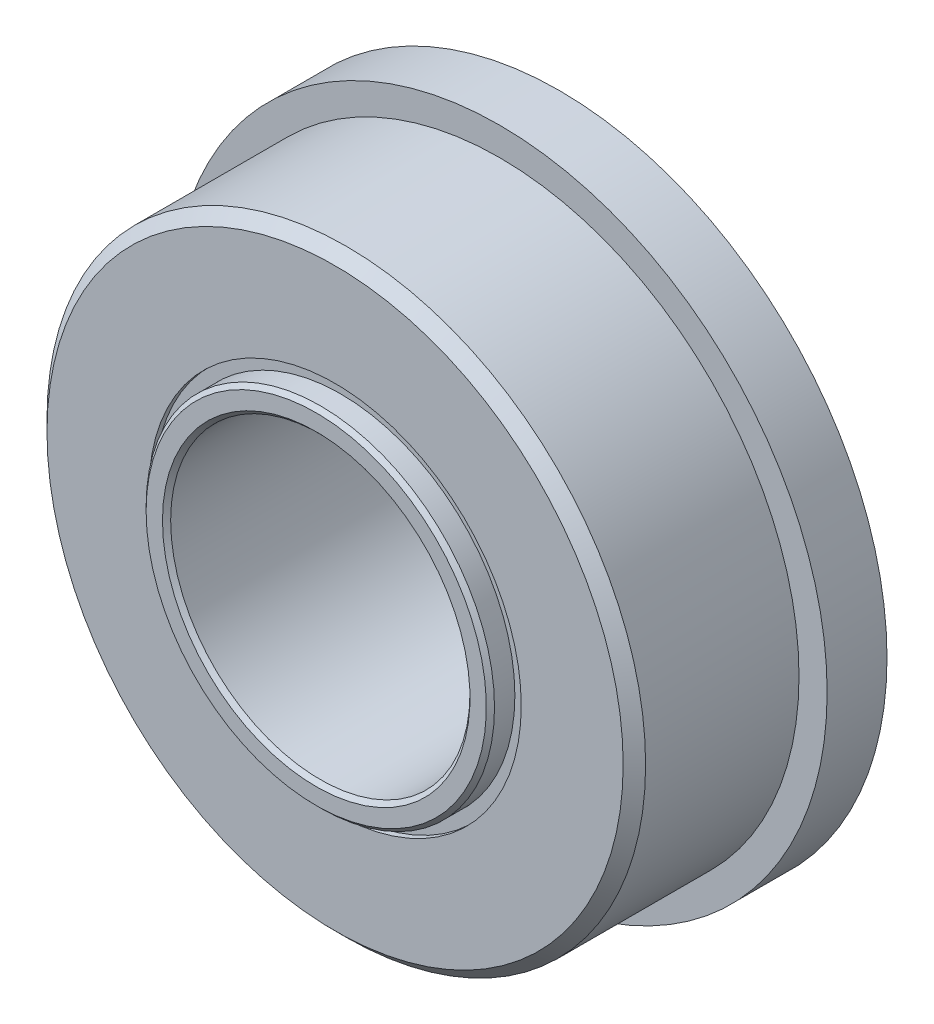
ISO-10303-21;
HEADER;
FILE_DESCRIPTION(('STEP AP214'),'2;1');
FILE_NAME('part.step','',(''),(''),'','','');
FILE_SCHEMA(('AUTOMOTIVE_DESIGN { 1 0 10303 214 1 1 1 1 }'));
ENDSEC;
DATA;
#1=APPLICATION_CONTEXT('core data for automotive mechanical design processes');
#2=APPLICATION_PROTOCOL_DEFINITION('international standard','automotive_design',2000,#1);
#3=PRODUCT_CONTEXT('',#1,'mechanical');
#4=PRODUCT('Part','Part','',(#3));
#5=PRODUCT_RELATED_PRODUCT_CATEGORY('part','',(#4));
#6=PRODUCT_DEFINITION_FORMATION('','',#4);
#7=PRODUCT_DEFINITION_CONTEXT('part definition',#1,'design');
#8=PRODUCT_DEFINITION('design','',#6,#7);
#9=PRODUCT_DEFINITION_SHAPE('','',#8);
#10=(LENGTH_UNIT() NAMED_UNIT(*) SI_UNIT(.MILLI.,.METRE.));
#11=(NAMED_UNIT(*) PLANE_ANGLE_UNIT() SI_UNIT($,.RADIAN.));
#12=(NAMED_UNIT(*) SI_UNIT($,.STERADIAN.) SOLID_ANGLE_UNIT());
#13=UNCERTAINTY_MEASURE_WITH_UNIT(LENGTH_MEASURE(1.E-05),#10,'distance_accuracy_value','');
#14=(GEOMETRIC_REPRESENTATION_CONTEXT(3) GLOBAL_UNCERTAINTY_ASSIGNED_CONTEXT((#13)) GLOBAL_UNIT_ASSIGNED_CONTEXT((#10,
#11,#12)) REPRESENTATION_CONTEXT('',''));
#15=CARTESIAN_POINT('',(0.,0.,0.));
#16=DIRECTION('',(0.,0.,1.));
#17=DIRECTION('',(1.,0.,0.));
#18=AXIS2_PLACEMENT_3D('',#15,#16,#17);
#19=CARTESIAN_POINT('',(0.,3.9497,-2.2621875));
#20=DIRECTION('',(0.,0.,1.));
#21=DIRECTION('',(1.,0.,0.));
#22=AXIS2_PLACEMENT_3D('',#19,#20,#21);
#23=PLANE('',#22);
#24=CARTESIAN_POINT('',(0.,0.,-2.2621875));
#25=DIRECTION('',(0.,0.,1.));
#26=DIRECTION('',(1.,0.,0.));
#27=AXIS2_PLACEMENT_3D('',#24,#25,#26);
#28=CIRCLE('',#27,3.9497);
#29=CARTESIAN_POINT('',(3.9497,0.,-2.2621875));
#30=VERTEX_POINT('',#29);
#31=EDGE_CURVE('E56',#30,#30,#28,.T.);
#32=ORIENTED_EDGE('',*,*,#31,.F.);
#33=EDGE_LOOP('',(#32));
#34=FACE_BOUND('',#33,.T.);
#35=CARTESIAN_POINT('',(0.,0.,-2.2621875));
#36=DIRECTION('',(0.,0.,1.));
#37=DIRECTION('',(1.,0.,0.));
#38=AXIS2_PLACEMENT_3D('',#35,#36,#37);
#39=CIRCLE('',#38,3.6957);
#40=CARTESIAN_POINT('',(3.6957,0.,-2.2621875));
#41=VERTEX_POINT('',#40);
#42=EDGE_CURVE('E11',#41,#41,#39,.T.);
#43=ORIENTED_EDGE('',*,*,#42,.T.);
#44=EDGE_LOOP('',(#43));
#45=FACE_BOUND('',#44,.T.);
#46=ADVANCED_FACE('F42',(#34,#45),#23,.F.);
#47=CARTESIAN_POINT('',(0.,0.,2.38125));
#48=DIRECTION('',(0.,0.,1.));
#49=DIRECTION('',(1.,0.,0.));
#50=AXIS2_PLACEMENT_3D('',#47,#48,#49);
#51=CYLINDRICAL_SURFACE('',#50,3.6957);
#52=ORIENTED_EDGE('',*,*,#42,.F.);
#53=EDGE_LOOP('',(#52));
#54=FACE_BOUND('',#53,.T.);
#55=CARTESIAN_POINT('',(0.,0.,-0.793750000000001));
#56=DIRECTION('',(0.,0.,1.));
#57=DIRECTION('',(1.,0.,0.));
#58=AXIS2_PLACEMENT_3D('',#55,#56,#57);
#59=CIRCLE('',#58,3.6957);
#60=CARTESIAN_POINT('',(3.6957,0.,-0.793750000000001));
#61=VERTEX_POINT('',#60);
#62=EDGE_CURVE('E48',#61,#61,#59,.T.);
#63=ORIENTED_EDGE('',*,*,#62,.T.);
#64=EDGE_LOOP('',(#63));
#65=FACE_BOUND('',#64,.T.);
#66=ADVANCED_FACE('F65',(#54,#65),#51,.F.);
#67=CARTESIAN_POINT('',(0.,3.9497,-0.793750000000001));
#68=DIRECTION('',(0.,0.,-1.));
#69=DIRECTION('',(-1.,0.,0.));
#70=AXIS2_PLACEMENT_3D('',#67,#68,#69);
#71=PLANE('',#70);
#72=ORIENTED_EDGE('',*,*,#62,.F.);
#73=EDGE_LOOP('',(#72));
#74=FACE_BOUND('',#73,.T.);
#75=CARTESIAN_POINT('',(0.,0.,-0.793750000000001));
#76=DIRECTION('',(0.,0.,1.));
#77=DIRECTION('',(1.,0.,0.));
#78=AXIS2_PLACEMENT_3D('',#75,#76,#77);
#79=CIRCLE('',#78,3.9497);
#80=CARTESIAN_POINT('',(3.9497,0.,-0.793750000000001));
#81=VERTEX_POINT('',#80);
#82=EDGE_CURVE('E52',#81,#81,#79,.T.);
#83=ORIENTED_EDGE('',*,*,#82,.T.);
#84=EDGE_LOOP('',(#83));
#85=FACE_BOUND('',#84,.T.);
#86=ADVANCED_FACE('F69',(#74,#85),#71,.F.);
#87=CARTESIAN_POINT('',(0.,0.,2.38125));
#88=DIRECTION('',(0.,0.,1.));
#89=DIRECTION('',(1.,0.,0.));
#90=AXIS2_PLACEMENT_3D('',#87,#88,#89);
#91=CYLINDRICAL_SURFACE('',#90,3.9497);
#92=ORIENTED_EDGE('',*,*,#82,.F.);
#93=EDGE_LOOP('',(#92));
#94=FACE_BOUND('',#93,.T.);
#95=ORIENTED_EDGE('',*,*,#31,.T.);
#96=EDGE_LOOP('',(#95));
#97=FACE_BOUND('',#96,.T.);
#98=ADVANCED_FACE('F62',(#94,#97),#91,.T.);
#99=CLOSED_SHELL('',(#46,#66,#86,#98));
#100=MANIFOLD_SOLID_BREP('B2',#99);
#101=CARTESIAN_POINT('',(0.,3.9497,2.2621875));
#102=DIRECTION('',(0.,0.,-1.));
#103=DIRECTION('',(-1.,0.,0.));
#104=AXIS2_PLACEMENT_3D('',#101,#102,#103);
#105=PLANE('',#104);
#106=CARTESIAN_POINT('',(0.,0.,2.2621875));
#107=DIRECTION('',(0.,0.,1.));
#108=DIRECTION('',(1.,0.,0.));
#109=AXIS2_PLACEMENT_3D('',#106,#107,#108);
#110=CIRCLE('',#109,3.6957);
#111=CARTESIAN_POINT('',(3.6957,0.,2.2621875));
#112=VERTEX_POINT('',#111);
#113=EDGE_CURVE('E41',#112,#112,#110,.T.);
#114=ORIENTED_EDGE('',*,*,#113,.F.);
#115=EDGE_LOOP('',(#114));
#116=FACE_BOUND('',#115,.T.);
#117=CARTESIAN_POINT('',(0.,0.,2.2621875));
#118=DIRECTION('',(0.,0.,1.));
#119=DIRECTION('',(1.,0.,0.));
#120=AXIS2_PLACEMENT_3D('',#117,#118,#119);
#121=CIRCLE('',#120,3.9497);
#122=CARTESIAN_POINT('',(3.9497,0.,2.2621875));
#123=VERTEX_POINT('',#122);
#124=EDGE_CURVE('E124',#123,#123,#121,.T.);
#125=ORIENTED_EDGE('',*,*,#124,.T.);
#126=EDGE_LOOP('',(#125));
#127=FACE_BOUND('',#126,.T.);
#128=ADVANCED_FACE('F110',(#116,#127),#105,.F.);
#129=CARTESIAN_POINT('',(0.,0.,2.38125));
#130=DIRECTION('',(0.,0.,1.));
#131=DIRECTION('',(1.,0.,0.));
#132=AXIS2_PLACEMENT_3D('',#129,#130,#131);
#133=CYLINDRICAL_SURFACE('',#132,3.6957);
#134=CARTESIAN_POINT('',(0.,0.,0.79375));
#135=DIRECTION('',(0.,0.,1.));
#136=DIRECTION('',(1.,0.,0.));
#137=AXIS2_PLACEMENT_3D('',#134,#135,#136);
#138=CIRCLE('',#137,3.6957);
#139=CARTESIAN_POINT('',(3.6957,0.,0.79375));
#140=VERTEX_POINT('',#139);
#141=EDGE_CURVE('E116',#140,#140,#138,.T.);
#142=ORIENTED_EDGE('',*,*,#141,.F.);
#143=EDGE_LOOP('',(#142));
#144=FACE_BOUND('',#143,.T.);
#145=ORIENTED_EDGE('',*,*,#113,.T.);
#146=EDGE_LOOP('',(#145));
#147=FACE_BOUND('',#146,.T.);
#148=ADVANCED_FACE('F139',(#144,#147),#133,.F.);
#149=CARTESIAN_POINT('',(0.,3.9497,0.79375));
#150=DIRECTION('',(0.,0.,1.));
#151=DIRECTION('',(1.,0.,0.));
#152=AXIS2_PLACEMENT_3D('',#149,#150,#151);
#153=PLANE('',#152);
#154=CARTESIAN_POINT('',(0.,0.,0.79375));
#155=DIRECTION('',(0.,0.,1.));
#156=DIRECTION('',(1.,0.,0.));
#157=AXIS2_PLACEMENT_3D('',#154,#155,#156);
#158=CIRCLE('',#157,3.9497);
#159=CARTESIAN_POINT('',(3.9497,0.,0.79375));
#160=VERTEX_POINT('',#159);
#161=EDGE_CURVE('E120',#160,#160,#158,.T.);
#162=ORIENTED_EDGE('',*,*,#161,.F.);
#163=EDGE_LOOP('',(#162));
#164=FACE_BOUND('',#163,.T.);
#165=ORIENTED_EDGE('',*,*,#141,.T.);
#166=EDGE_LOOP('',(#165));
#167=FACE_BOUND('',#166,.T.);
#168=ADVANCED_FACE('F134',(#164,#167),#153,.F.);
#169=CARTESIAN_POINT('',(0.,0.,2.38125));
#170=DIRECTION('',(0.,0.,1.));
#171=DIRECTION('',(1.,0.,0.));
#172=AXIS2_PLACEMENT_3D('',#169,#170,#171);
#173=CYLINDRICAL_SURFACE('',#172,3.9497);
#174=ORIENTED_EDGE('',*,*,#124,.F.);
#175=EDGE_LOOP('',(#174));
#176=FACE_BOUND('',#175,.T.);
#177=ORIENTED_EDGE('',*,*,#161,.T.);
#178=EDGE_LOOP('',(#177));
#179=FACE_BOUND('',#178,.T.);
#180=ADVANCED_FACE('F131',(#176,#179),#173,.T.);
#181=CLOSED_SHELL('',(#128,#148,#168,#180));
#182=MANIFOLD_SOLID_BREP('B6',#181);
#183=CARTESIAN_POINT('',(-2.11454999999995,3.6625080351448,0.));
#184=DIRECTION('',(0.,0.,1.));
#185=DIRECTION('',(-0.499999999999989,0.866025403784445,0.));
#186=AXIS2_PLACEMENT_3D('',#183,#184,#185);
#187=SPHERICAL_SURFACE('',#186,0.79375);
#188=CARTESIAN_POINT('',(-2.11454999999995,3.6625080351448,0.79375));
#189=VERTEX_POINT('',#188);
#190=VERTEX_LOOP('',#189);
#191=FACE_BOUND('',#190,.T.);
#192=ADVANCED_FACE('F178',(#191),#187,.T.);
#193=CLOSED_SHELL('',(#192));
#194=MANIFOLD_SOLID_BREP('B36',#193);
#195=CARTESIAN_POINT('',(-3.66250803514474,2.11455000000004,0.));
#196=DIRECTION('',(0.,0.,1.));
#197=DIRECTION('',(-0.866025403784433,0.50000000000001,0.));
#198=AXIS2_PLACEMENT_3D('',#195,#196,#197);
#199=SPHERICAL_SURFACE('',#198,0.79375);
#200=CARTESIAN_POINT('',(-3.66250803514474,2.11455000000004,0.79375));
#201=VERTEX_POINT('',#200);
#202=VERTEX_LOOP('',#201);
#203=FACE_BOUND('',#202,.T.);
#204=ADVANCED_FACE('F199',(#203),#199,.T.);
#205=CLOSED_SHELL('',(#204));
#206=MANIFOLD_SOLID_BREP('B106',#205);
#207=CARTESIAN_POINT('',(-4.2291,0.,0.));
#208=DIRECTION('',(0.,0.,1.));
#209=DIRECTION('',(-1.,0.,0.));
#210=AXIS2_PLACEMENT_3D('',#207,#208,#209);
#211=SPHERICAL_SURFACE('',#210,0.79375);
#212=CARTESIAN_POINT('',(-4.2291,0.,0.79375));
#213=VERTEX_POINT('',#212);
#214=VERTEX_LOOP('',#213);
#215=FACE_BOUND('',#214,.T.);
#216=ADVANCED_FACE('F220',(#215),#211,.T.);
#217=CLOSED_SHELL('',(#216));
#218=MANIFOLD_SOLID_BREP('B174',#217);
#219=CARTESIAN_POINT('',(-3.66250803514479,-2.11454999999997,0.));
#220=DIRECTION('',(0.,0.,1.));
#221=DIRECTION('',(-0.866025403784443,-0.499999999999992,0.));
#222=AXIS2_PLACEMENT_3D('',#219,#220,#221);
#223=SPHERICAL_SURFACE('',#222,0.79375);
#224=CARTESIAN_POINT('',(-3.66250803514479,-2.11454999999997,0.79375));
#225=VERTEX_POINT('',#224);
#226=VERTEX_LOOP('',#225);
#227=FACE_BOUND('',#226,.T.);
#228=ADVANCED_FACE('F241',(#227),#223,.T.);
#229=CLOSED_SHELL('',(#228));
#230=MANIFOLD_SOLID_BREP('B195',#229);
#231=CARTESIAN_POINT('',(-2.11455000000003,-3.66250803514475,0.));
#232=DIRECTION('',(0.,0.,1.));
#233=DIRECTION('',(-0.500000000000007,-0.866025403784435,0.));
#234=AXIS2_PLACEMENT_3D('',#231,#232,#233);
#235=SPHERICAL_SURFACE('',#234,0.79375);
#236=CARTESIAN_POINT('',(-2.11455000000003,-3.66250803514475,0.79375));
#237=VERTEX_POINT('',#236);
#238=VERTEX_LOOP('',#237);
#239=FACE_BOUND('',#238,.T.);
#240=ADVANCED_FACE('F262',(#239),#235,.T.);
#241=CLOSED_SHELL('',(#240));
#242=MANIFOLD_SOLID_BREP('B216',#241);
#243=CARTESIAN_POINT('',(0.,-4.2291,0.));
#244=DIRECTION('',(0.,0.,1.));
#245=DIRECTION('',(0.,-1.,0.));
#246=AXIS2_PLACEMENT_3D('',#243,#244,#245);
#247=SPHERICAL_SURFACE('',#246,0.79375);
#248=CARTESIAN_POINT('',(0.,-4.2291,0.79375));
#249=VERTEX_POINT('',#248);
#250=VERTEX_LOOP('',#249);
#251=FACE_BOUND('',#250,.T.);
#252=ADVANCED_FACE('F283',(#251),#247,.T.);
#253=CLOSED_SHELL('',(#252));
#254=MANIFOLD_SOLID_BREP('B237',#253);
#255=CARTESIAN_POINT('',(2.11454999999998,-3.66250803514478,0.));
#256=DIRECTION('',(0.,0.,1.));
#257=DIRECTION('',(0.499999999999995,-0.866025403784442,0.));
#258=AXIS2_PLACEMENT_3D('',#255,#256,#257);
#259=SPHERICAL_SURFACE('',#258,0.79375);
#260=CARTESIAN_POINT('',(2.11454999999998,-3.66250803514478,0.79375));
#261=VERTEX_POINT('',#260);
#262=VERTEX_LOOP('',#261);
#263=FACE_BOUND('',#262,.T.);
#264=ADVANCED_FACE('F304',(#263),#259,.T.);
#265=CLOSED_SHELL('',(#264));
#266=MANIFOLD_SOLID_BREP('B258',#265);
#267=CARTESIAN_POINT('',(3.66250803514476,-2.11455000000002,0.));
#268=DIRECTION('',(0.,0.,1.));
#269=DIRECTION('',(0.866025403784436,-0.500000000000004,0.));
#270=AXIS2_PLACEMENT_3D('',#267,#268,#269);
#271=SPHERICAL_SURFACE('',#270,0.79375);
#272=CARTESIAN_POINT('',(3.66250803514476,-2.11455000000002,0.79375));
#273=VERTEX_POINT('',#272);
#274=VERTEX_LOOP('',#273);
#275=FACE_BOUND('',#274,.T.);
#276=ADVANCED_FACE('F325',(#275),#271,.T.);
#277=CLOSED_SHELL('',(#276));
#278=MANIFOLD_SOLID_BREP('B279',#277);
#279=CARTESIAN_POINT('',(4.2291,0.,0.));
#280=DIRECTION('',(0.,0.,1.));
#281=DIRECTION('',(1.,0.,0.));
#282=AXIS2_PLACEMENT_3D('',#279,#280,#281);
#283=SPHERICAL_SURFACE('',#282,0.79375);
#284=CARTESIAN_POINT('',(4.2291,0.,0.79375));
#285=VERTEX_POINT('',#284);
#286=VERTEX_LOOP('',#285);
#287=FACE_BOUND('',#286,.T.);
#288=ADVANCED_FACE('F346',(#287),#283,.T.);
#289=CLOSED_SHELL('',(#288));
#290=MANIFOLD_SOLID_BREP('B300',#289);
#291=CARTESIAN_POINT('',(3.66250803514477,2.11454999999999,0.));
#292=DIRECTION('',(0.,0.,1.));
#293=DIRECTION('',(0.86602540378444,0.499999999999998,0.));
#294=AXIS2_PLACEMENT_3D('',#291,#292,#293);
#295=SPHERICAL_SURFACE('',#294,0.79375);
#296=CARTESIAN_POINT('',(3.66250803514477,2.11454999999999,0.79375));
#297=VERTEX_POINT('',#296);
#298=VERTEX_LOOP('',#297);
#299=FACE_BOUND('',#298,.T.);
#300=ADVANCED_FACE('F367',(#299),#295,.T.);
#301=CLOSED_SHELL('',(#300));
#302=MANIFOLD_SOLID_BREP('B321',#301);
#303=CARTESIAN_POINT('',(2.11455,3.66250803514477,0.));
#304=DIRECTION('',(0.,0.,1.));
#305=DIRECTION('',(0.500000000000001,0.866025403784438,0.));
#306=AXIS2_PLACEMENT_3D('',#303,#304,#305);
#307=SPHERICAL_SURFACE('',#306,0.79375);
#308=CARTESIAN_POINT('',(2.11455,3.66250803514477,0.79375));
#309=VERTEX_POINT('',#308);
#310=VERTEX_LOOP('',#309);
#311=FACE_BOUND('',#310,.T.);
#312=ADVANCED_FACE('F388',(#311),#307,.T.);
#313=CLOSED_SHELL('',(#312));
#314=MANIFOLD_SOLID_BREP('B342',#313);
#315=CARTESIAN_POINT('',(0.,4.2291,0.));
#316=DIRECTION('',(0.,0.,1.));
#317=DIRECTION('',(0.,1.,0.));
#318=AXIS2_PLACEMENT_3D('',#315,#316,#317);
#319=SPHERICAL_SURFACE('',#318,0.79375);
#320=CARTESIAN_POINT('',(0.,4.2291,0.79375));
#321=VERTEX_POINT('',#320);
#322=VERTEX_LOOP('',#321);
#323=FACE_BOUND('',#322,.T.);
#324=ADVANCED_FACE('F411',(#323),#319,.T.);
#325=CLOSED_SHELL('',(#324));
#326=MANIFOLD_SOLID_BREP('B363',#325);
#327=CARTESIAN_POINT('',(0.,0.,2.38125));
#328=DIRECTION('',(0.,0.,1.));
#329=DIRECTION('',(1.,0.,0.));
#330=AXIS2_PLACEMENT_3D('',#327,#328,#329);
#331=CYLINDRICAL_SURFACE('',#330,3.6957);
#332=CARTESIAN_POINT('',(0.,0.,2.69451666666667));
#333=DIRECTION('',(0.,0.,-1.));
#334=DIRECTION('',(-1.,0.,0.));
#335=AXIS2_PLACEMENT_3D('',#332,#333,#334);
#336=CIRCLE('',#335,3.6957);
#337=CARTESIAN_POINT('',(-3.6957,0.,2.69451666666667));
#338=VERTEX_POINT('',#337);
#339=EDGE_CURVE('E410',#338,#338,#336,.T.);
#340=ORIENTED_EDGE('',*,*,#339,.T.);
#341=EDGE_LOOP('',(#340));
#342=FACE_BOUND('',#341,.T.);
#343=CARTESIAN_POINT('',(0.,0.,0.587812472222221));
#344=DIRECTION('',(0.,0.,1.));
#345=DIRECTION('',(1.,0.,0.));
#346=AXIS2_PLACEMENT_3D('',#343,#344,#345);
#347=CIRCLE('',#346,3.6957);
#348=CARTESIAN_POINT('',(3.6957,0.,0.587812472222221));
#349=VERTEX_POINT('',#348);
#350=EDGE_CURVE('E466',#349,#349,#347,.T.);
#351=ORIENTED_EDGE('',*,*,#350,.T.);
#352=EDGE_LOOP('',(#351));
#353=FACE_BOUND('',#352,.T.);
#354=ADVANCED_FACE('F431',(#342,#353),#331,.T.);
#355=CARTESIAN_POINT('',(0.,3.6957,2.7813));
#356=DIRECTION('',(0.,0.,-1.));
#357=DIRECTION('',(-1.,0.,0.));
#358=AXIS2_PLACEMENT_3D('',#355,#356,#357);
#359=PLANE('',#358);
#360=CARTESIAN_POINT('',(0.,0.,2.7813));
#361=DIRECTION('',(0.,0.,-1.));
#362=DIRECTION('',(-1.,0.,0.));
#363=AXIS2_PLACEMENT_3D('',#360,#361,#362);
#364=CIRCLE('',#363,3.60891666666666);
#365=CARTESIAN_POINT('',(-3.60891666666666,0.,2.7813));
#366=VERTEX_POINT('',#365);
#367=EDGE_CURVE('E438',#366,#366,#364,.F.);
#368=ORIENTED_EDGE('',*,*,#367,.T.);
#369=EDGE_LOOP('',(#368));
#370=FACE_BOUND('',#369,.T.);
#371=CARTESIAN_POINT('',(0.,0.,2.7813));
#372=DIRECTION('',(0.,0.,-1.));
#373=DIRECTION('',(-1.,0.,0.));
#374=AXIS2_PLACEMENT_3D('',#371,#372,#373);
#375=CIRCLE('',#374,3.26178333333333);
#376=CARTESIAN_POINT('',(-3.26178333333333,0.,2.7813));
#377=VERTEX_POINT('',#376);
#378=EDGE_CURVE('E442',#377,#377,#375,.T.);
#379=ORIENTED_EDGE('',*,*,#378,.T.);
#380=EDGE_LOOP('',(#379));
#381=FACE_BOUND('',#380,.T.);
#382=ADVANCED_FACE('F490',(#370,#381),#359,.F.);
#383=CARTESIAN_POINT('',(0.,0.,2.38125));
#384=DIRECTION('',(0.,0.,1.));
#385=DIRECTION('',(1.,0.,0.));
#386=AXIS2_PLACEMENT_3D('',#383,#384,#385);
#387=CYLINDRICAL_SURFACE('',#386,3.175);
#388=CARTESIAN_POINT('',(0.,0.,-2.69451666666667));
#389=DIRECTION('',(0.,0.,1.));
#390=DIRECTION('',(1.,0.,0.));
#391=AXIS2_PLACEMENT_3D('',#388,#389,#390);
#392=CIRCLE('',#391,3.175);
#393=CARTESIAN_POINT('',(3.175,0.,-2.69451666666667));
#394=VERTEX_POINT('',#393);
#395=EDGE_CURVE('E451',#394,#394,#392,.F.);
#396=ORIENTED_EDGE('',*,*,#395,.T.);
#397=EDGE_LOOP('',(#396));
#398=FACE_BOUND('',#397,.T.);
#399=CARTESIAN_POINT('',(0.,0.,2.69451666666667));
#400=DIRECTION('',(0.,0.,-1.));
#401=DIRECTION('',(-1.,0.,0.));
#402=AXIS2_PLACEMENT_3D('',#399,#400,#401);
#403=CIRCLE('',#402,3.175);
#404=CARTESIAN_POINT('',(-3.175,0.,2.69451666666667));
#405=VERTEX_POINT('',#404);
#406=EDGE_CURVE('E454',#405,#405,#403,.F.);
#407=ORIENTED_EDGE('',*,*,#406,.T.);
#408=EDGE_LOOP('',(#407));
#409=FACE_BOUND('',#408,.T.);
#410=ADVANCED_FACE('F486',(#398,#409),#387,.F.);
#411=CARTESIAN_POINT('',(0.,3.175,-2.7813));
#412=DIRECTION('',(0.,0.,1.));
#413=DIRECTION('',(1.,0.,0.));
#414=AXIS2_PLACEMENT_3D('',#411,#412,#413);
#415=PLANE('',#414);
#416=CARTESIAN_POINT('',(0.,0.,-2.7813));
#417=DIRECTION('',(0.,0.,1.));
#418=DIRECTION('',(1.,0.,0.));
#419=AXIS2_PLACEMENT_3D('',#416,#417,#418);
#420=CIRCLE('',#419,3.26178333333333);
#421=CARTESIAN_POINT('',(3.26178333333333,0.,-2.7813));
#422=VERTEX_POINT('',#421);
#423=EDGE_CURVE('E457',#422,#422,#420,.T.);
#424=ORIENTED_EDGE('',*,*,#423,.T.);
#425=EDGE_LOOP('',(#424));
#426=FACE_BOUND('',#425,.T.);
#427=CARTESIAN_POINT('',(0.,0.,-2.7813));
#428=DIRECTION('',(0.,0.,1.));
#429=DIRECTION('',(1.,0.,0.));
#430=AXIS2_PLACEMENT_3D('',#427,#428,#429);
#431=CIRCLE('',#430,3.60891666666667);
#432=CARTESIAN_POINT('',(3.60891666666667,0.,-2.7813));
#433=VERTEX_POINT('',#432);
#434=EDGE_CURVE('E460',#433,#433,#431,.F.);
#435=ORIENTED_EDGE('',*,*,#434,.T.);
#436=EDGE_LOOP('',(#435));
#437=FACE_BOUND('',#436,.T.);
#438=ADVANCED_FACE('F480',(#426,#437),#415,.F.);
#439=CARTESIAN_POINT('',(0.,0.,2.38125));
#440=DIRECTION('',(0.,0.,1.));
#441=DIRECTION('',(1.,0.,0.));
#442=AXIS2_PLACEMENT_3D('',#439,#440,#441);
#443=CYLINDRICAL_SURFACE('',#442,3.6957);
#444=CARTESIAN_POINT('',(0.,0.,-2.69451666666667));
#445=DIRECTION('',(0.,0.,1.));
#446=DIRECTION('',(1.,0.,0.));
#447=AXIS2_PLACEMENT_3D('',#444,#445,#446);
#448=CIRCLE('',#447,3.6957);
#449=CARTESIAN_POINT('',(3.6957,0.,-2.69451666666667));
#450=VERTEX_POINT('',#449);
#451=EDGE_CURVE('E446',#450,#450,#448,.T.);
#452=ORIENTED_EDGE('',*,*,#451,.T.);
#453=EDGE_LOOP('',(#452));
#454=FACE_BOUND('',#453,.T.);
#455=CARTESIAN_POINT('',(0.,0.,-0.587812472222221));
#456=DIRECTION('',(0.,0.,1.));
#457=DIRECTION('',(1.,0.,0.));
#458=AXIS2_PLACEMENT_3D('',#455,#456,#457);
#459=CIRCLE('',#458,3.6957);
#460=CARTESIAN_POINT('',(3.6957,0.,-0.587812472222221));
#461=VERTEX_POINT('',#460);
#462=EDGE_CURVE('E463',#461,#461,#459,.T.);
#463=ORIENTED_EDGE('',*,*,#462,.F.);
#464=EDGE_LOOP('',(#463));
#465=FACE_BOUND('',#464,.T.);
#466=ADVANCED_FACE('F475',(#454,#465),#443,.T.);
#467=CARTESIAN_POINT('',(0.,0.,0.));
#468=DIRECTION('',(0.,0.,1.));
#469=DIRECTION('',(1.,0.,0.));
#470=AXIS2_PLACEMENT_3D('',#467,#468,#469);
#471=TOROIDAL_SURFACE('',#470,4.2291,0.79375);
#472=ORIENTED_EDGE('',*,*,#350,.F.);
#473=EDGE_LOOP('',(#472));
#474=FACE_BOUND('',#473,.T.);
#475=ORIENTED_EDGE('',*,*,#462,.T.);
#476=EDGE_LOOP('',(#475));
#477=FACE_BOUND('',#476,.T.);
#478=ADVANCED_FACE('F471',(#474,#477),#471,.F.);
#479=CARTESIAN_POINT('',(0.,0.,-2.7813));
#480=DIRECTION('',(0.,0.,-1.));
#481=DIRECTION('',(-1.,0.,0.));
#482=AXIS2_PLACEMENT_3D('',#479,#480,#481);
#483=CONICAL_SURFACE('',#482,3.26178333333333,0.785398163397446);
#484=ORIENTED_EDGE('',*,*,#395,.F.);
#485=EDGE_LOOP('',(#484));
#486=FACE_BOUND('',#485,.T.);
#487=ORIENTED_EDGE('',*,*,#423,.F.);
#488=EDGE_LOOP('',(#487));
#489=FACE_BOUND('',#488,.T.);
#490=ADVANCED_FACE('F474',(#486,#489),#483,.F.);
#491=CARTESIAN_POINT('',(0.,0.,-2.69451666666667));
#492=DIRECTION('',(0.,0.,1.));
#493=DIRECTION('',(1.,0.,0.));
#494=AXIS2_PLACEMENT_3D('',#491,#492,#493);
#495=CONICAL_SURFACE('',#494,3.6957,0.785398163397451);
#496=ORIENTED_EDGE('',*,*,#434,.F.);
#497=EDGE_LOOP('',(#496));
#498=FACE_BOUND('',#497,.T.);
#499=ORIENTED_EDGE('',*,*,#451,.F.);
#500=EDGE_LOOP('',(#499));
#501=FACE_BOUND('',#500,.T.);
#502=ADVANCED_FACE('F500',(#498,#501),#495,.T.);
#503=CARTESIAN_POINT('',(0.,0.,2.7813));
#504=DIRECTION('',(0.,0.,-1.));
#505=DIRECTION('',(-1.,0.,0.));
#506=AXIS2_PLACEMENT_3D('',#503,#504,#505);
#507=CONICAL_SURFACE('',#506,3.60891666666666,0.785398163397448);
#508=ORIENTED_EDGE('',*,*,#339,.F.);
#509=EDGE_LOOP('',(#508));
#510=FACE_BOUND('',#509,.T.);
#511=ORIENTED_EDGE('',*,*,#367,.F.);
#512=EDGE_LOOP('',(#511));
#513=FACE_BOUND('',#512,.T.);
#514=ADVANCED_FACE('F503',(#510,#513),#507,.T.);
#515=CARTESIAN_POINT('',(0.,0.,2.69451666666667));
#516=DIRECTION('',(0.,0.,1.));
#517=DIRECTION('',(1.,0.,0.));
#518=AXIS2_PLACEMENT_3D('',#515,#516,#517);
#519=CONICAL_SURFACE('',#518,3.175,0.785398163397448);
#520=ORIENTED_EDGE('',*,*,#378,.F.);
#521=EDGE_LOOP('',(#520));
#522=FACE_BOUND('',#521,.T.);
#523=ORIENTED_EDGE('',*,*,#406,.F.);
#524=EDGE_LOOP('',(#523));
#525=FACE_BOUND('',#524,.T.);
#526=ADVANCED_FACE('F433',(#522,#525),#519,.F.);
#527=CLOSED_SHELL('',(#354,#382,#410,#438,#466,#478,#490,#502,#514,#526));
#528=MANIFOLD_SOLID_BREP('B384',#527);
#529=CARTESIAN_POINT('',(0.,0.,2.143125));
#530=DIRECTION('',(0.,0.,-1.));
#531=DIRECTION('',(-1.,0.,0.));
#532=AXIS2_PLACEMENT_3D('',#529,#530,#531);
#533=CONICAL_SURFACE('',#532,6.35,0.785398163397447);
#534=CARTESIAN_POINT('',(0.,0.,2.38125));
#535=DIRECTION('',(0.,0.,1.));
#536=DIRECTION('',(1.,0.,0.));
#537=AXIS2_PLACEMENT_3D('',#534,#535,#536);
#538=CIRCLE('',#537,6.111875);
#539=CARTESIAN_POINT('',(6.111875,0.,2.38125));
#540=VERTEX_POINT('',#539);
#541=EDGE_CURVE('E605',#540,#540,#538,.T.);
#542=ORIENTED_EDGE('',*,*,#541,.F.);
#543=EDGE_LOOP('',(#542));
#544=FACE_BOUND('',#543,.T.);
#545=CARTESIAN_POINT('',(0.,0.,2.143125));
#546=DIRECTION('',(0.,0.,1.));
#547=DIRECTION('',(1.,0.,0.));
#548=AXIS2_PLACEMENT_3D('',#545,#546,#547);
#549=CIRCLE('',#548,6.35);
#550=CARTESIAN_POINT('',(6.35,0.,2.143125));
#551=VERTEX_POINT('',#550);
#552=EDGE_CURVE('E430',#551,#551,#549,.T.);
#553=ORIENTED_EDGE('',*,*,#552,.T.);
#554=EDGE_LOOP('',(#553));
#555=FACE_BOUND('',#554,.T.);
#556=ADVANCED_FACE('F583',(#544,#555),#533,.T.);
#557=CARTESIAN_POINT('',(0.,0.,2.38125));
#558=DIRECTION('',(0.,0.,1.));
#559=DIRECTION('',(1.,0.,0.));
#560=AXIS2_PLACEMENT_3D('',#557,#558,#559);
#561=CYLINDRICAL_SURFACE('',#560,6.35);
#562=CARTESIAN_POINT('',(0.,0.,-1.11125));
#563=DIRECTION('',(0.,0.,1.));
#564=DIRECTION('',(1.,0.,0.));
#565=AXIS2_PLACEMENT_3D('',#562,#563,#564);
#566=CIRCLE('',#565,6.35);
#567=CARTESIAN_POINT('',(6.35,0.,-1.11125));
#568=VERTEX_POINT('',#567);
#569=EDGE_CURVE('E608',#568,#568,#566,.T.);
#570=ORIENTED_EDGE('',*,*,#569,.T.);
#571=EDGE_LOOP('',(#570));
#572=FACE_BOUND('',#571,.T.);
#573=ORIENTED_EDGE('',*,*,#552,.F.);
#574=EDGE_LOOP('',(#573));
#575=FACE_BOUND('',#574,.T.);
#576=ADVANCED_FACE('F628',(#572,#575),#561,.T.);
#577=CARTESIAN_POINT('',(0.,6.111875,-2.38125));
#578=DIRECTION('',(0.,0.,1.));
#579=DIRECTION('',(1.,0.,0.));
#580=AXIS2_PLACEMENT_3D('',#577,#578,#579);
#581=PLANE('',#580);
#582=CARTESIAN_POINT('',(0.,0.,-2.38125));
#583=DIRECTION('',(0.,0.,1.));
#584=DIRECTION('',(1.,0.,0.));
#585=AXIS2_PLACEMENT_3D('',#582,#583,#584);
#586=CIRCLE('',#585,3.9497);
#587=CARTESIAN_POINT('',(3.9497,0.,-2.38125));
#588=VERTEX_POINT('',#587);
#589=EDGE_CURVE('E589',#588,#588,#586,.T.);
#590=ORIENTED_EDGE('',*,*,#589,.T.);
#591=EDGE_LOOP('',(#590));
#592=FACE_BOUND('',#591,.T.);
#593=CARTESIAN_POINT('',(0.,0.,-2.38125));
#594=DIRECTION('',(0.,0.,-1.));
#595=DIRECTION('',(-1.,0.,0.));
#596=AXIS2_PLACEMENT_3D('',#593,#594,#595);
#597=CIRCLE('',#596,6.9469);
#598=CARTESIAN_POINT('',(-6.9469,0.,-2.38125));
#599=VERTEX_POINT('',#598);
#600=EDGE_CURVE('E611',#599,#599,#597,.T.);
#601=ORIENTED_EDGE('',*,*,#600,.T.);
#602=EDGE_LOOP('',(#601));
#603=FACE_BOUND('',#602,.T.);
#604=ADVANCED_FACE('F631',(#592,#603),#581,.F.);
#605=CARTESIAN_POINT('',(0.,0.,2.38125));
#606=DIRECTION('',(0.,0.,1.));
#607=DIRECTION('',(1.,0.,0.));
#608=AXIS2_PLACEMENT_3D('',#605,#606,#607);
#609=CYLINDRICAL_SURFACE('',#608,3.9497);
#610=CARTESIAN_POINT('',(0.,0.,-0.74295));
#611=DIRECTION('',(0.,0.,1.));
#612=DIRECTION('',(1.,0.,0.));
#613=AXIS2_PLACEMENT_3D('',#610,#611,#612);
#614=CIRCLE('',#613,3.9497);
#615=CARTESIAN_POINT('',(3.9497,0.,-0.74295));
#616=VERTEX_POINT('',#615);
#617=EDGE_CURVE('E593',#616,#616,#614,.T.);
#618=ORIENTED_EDGE('',*,*,#617,.T.);
#619=EDGE_LOOP('',(#618));
#620=FACE_BOUND('',#619,.T.);
#621=ORIENTED_EDGE('',*,*,#589,.F.);
#622=EDGE_LOOP('',(#621));
#623=FACE_BOUND('',#622,.T.);
#624=ADVANCED_FACE('F636',(#620,#623),#609,.F.);
#625=CARTESIAN_POINT('',(0.,0.,0.));
#626=DIRECTION('',(0.,0.,1.));
#627=DIRECTION('',(1.,0.,0.));
#628=AXIS2_PLACEMENT_3D('',#625,#626,#627);
#629=TOROIDAL_SURFACE('',#628,4.2291,0.79375);
#630=ORIENTED_EDGE('',*,*,#617,.F.);
#631=EDGE_LOOP('',(#630));
#632=FACE_BOUND('',#631,.T.);
#633=CARTESIAN_POINT('',(0.,0.,0.74295));
#634=DIRECTION('',(0.,0.,1.));
#635=DIRECTION('',(1.,0.,0.));
#636=AXIS2_PLACEMENT_3D('',#633,#634,#635);
#637=CIRCLE('',#636,3.9497);
#638=CARTESIAN_POINT('',(3.9497,0.,0.74295));
#639=VERTEX_POINT('',#638);
#640=EDGE_CURVE('E597',#639,#639,#637,.T.);
#641=ORIENTED_EDGE('',*,*,#640,.T.);
#642=EDGE_LOOP('',(#641));
#643=FACE_BOUND('',#642,.T.);
#644=ADVANCED_FACE('F642',(#632,#643),#629,.F.);
#645=CARTESIAN_POINT('',(0.,0.,2.38125));
#646=DIRECTION('',(0.,0.,1.));
#647=DIRECTION('',(1.,0.,0.));
#648=AXIS2_PLACEMENT_3D('',#645,#646,#647);
#649=CYLINDRICAL_SURFACE('',#648,3.9497);
#650=ORIENTED_EDGE('',*,*,#640,.F.);
#651=EDGE_LOOP('',(#650));
#652=FACE_BOUND('',#651,.T.);
#653=CARTESIAN_POINT('',(0.,0.,2.38125));
#654=DIRECTION('',(0.,0.,1.));
#655=DIRECTION('',(1.,0.,0.));
#656=AXIS2_PLACEMENT_3D('',#653,#654,#655);
#657=CIRCLE('',#656,3.9497);
#658=CARTESIAN_POINT('',(3.9497,0.,2.38125));
#659=VERTEX_POINT('',#658);
#660=EDGE_CURVE('E602',#659,#659,#657,.T.);
#661=ORIENTED_EDGE('',*,*,#660,.T.);
#662=EDGE_LOOP('',(#661));
#663=FACE_BOUND('',#662,.T.);
#664=ADVANCED_FACE('F646',(#652,#663),#649,.F.);
#665=CARTESIAN_POINT('',(0.,6.111875,2.38125));
#666=DIRECTION('',(0.,0.,-1.));
#667=DIRECTION('',(-1.,0.,0.));
#668=AXIS2_PLACEMENT_3D('',#665,#666,#667);
#669=PLANE('',#668);
#670=ORIENTED_EDGE('',*,*,#660,.F.);
#671=EDGE_LOOP('',(#670));
#672=FACE_BOUND('',#671,.T.);
#673=ORIENTED_EDGE('',*,*,#541,.T.);
#674=EDGE_LOOP('',(#673));
#675=FACE_BOUND('',#674,.T.);
#676=ADVANCED_FACE('F624',(#672,#675),#669,.F.);
#677=CARTESIAN_POINT('',(0.,3.9497,-1.11125));
#678=DIRECTION('',(0.,0.,1.));
#679=DIRECTION('',(1.,0.,0.));
#680=AXIS2_PLACEMENT_3D('',#677,#678,#679);
#681=PLANE('',#680);
#682=CARTESIAN_POINT('',(0.,0.,-1.11125));
#683=DIRECTION('',(0.,0.,-1.));
#684=DIRECTION('',(-1.,0.,0.));
#685=AXIS2_PLACEMENT_3D('',#682,#683,#684);
#686=CIRCLE('',#685,6.9469);
#687=CARTESIAN_POINT('',(-6.9469,0.,-1.11125));
#688=VERTEX_POINT('',#687);
#689=EDGE_CURVE('E614',#688,#688,#686,.T.);
#690=ORIENTED_EDGE('',*,*,#689,.F.);
#691=EDGE_LOOP('',(#690));
#692=FACE_BOUND('',#691,.T.);
#693=ORIENTED_EDGE('',*,*,#569,.F.);
#694=EDGE_LOOP('',(#693));
#695=FACE_BOUND('',#694,.T.);
#696=ADVANCED_FACE('F621',(#692,#695),#681,.T.);
#697=CARTESIAN_POINT('',(0.,0.,-2.38125));
#698=DIRECTION('',(0.,0.,-1.));
#699=DIRECTION('',(-1.,0.,0.));
#700=AXIS2_PLACEMENT_3D('',#697,#698,#699);
#701=CYLINDRICAL_SURFACE('',#700,6.9469);
#702=ORIENTED_EDGE('',*,*,#689,.T.);
#703=EDGE_LOOP('',(#702));
#704=FACE_BOUND('',#703,.T.);
#705=ORIENTED_EDGE('',*,*,#600,.F.);
#706=EDGE_LOOP('',(#705));
#707=FACE_BOUND('',#706,.T.);
#708=ADVANCED_FACE('F618',(#704,#707),#701,.T.);
#709=CLOSED_SHELL('',(#556,#576,#604,#624,#644,#664,#676,#696,#708));
#710=MANIFOLD_SOLID_BREP('B405',#709);
#711=ADVANCED_BREP_SHAPE_REPRESENTATION('',(#18,#100,#182,#194,#206,#218,#230,#242,#254,#266,
#278,#290,#302,#314,#326,#528,#710),#14);
#712=SHAPE_DEFINITION_REPRESENTATION(#9,#711);
ENDSEC;
END-ISO-10303-21;
